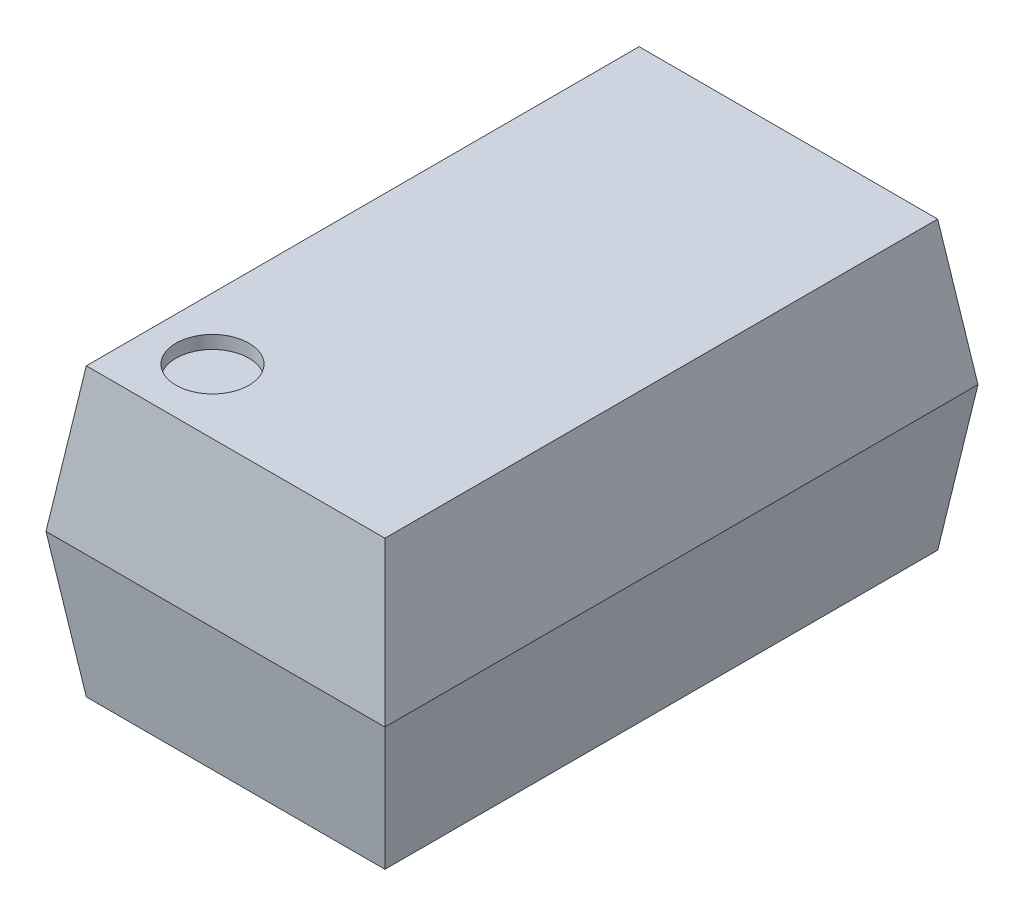
ISO-10303-21;
HEADER;
FILE_DESCRIPTION(('STEP AP214'),'2;1');
FILE_NAME('part.step','',(''),(''),'','','');
FILE_SCHEMA(('AUTOMOTIVE_DESIGN { 1 0 10303 214 1 1 1 1 }'));
ENDSEC;
DATA;
#1=APPLICATION_CONTEXT('core data for automotive mechanical design processes');
#2=APPLICATION_PROTOCOL_DEFINITION('international standard','automotive_design',2000,#1);
#3=PRODUCT_CONTEXT('',#1,'mechanical');
#4=PRODUCT('Part','Part','',(#3));
#5=PRODUCT_RELATED_PRODUCT_CATEGORY('part','',(#4));
#6=PRODUCT_DEFINITION_FORMATION('','',#4);
#7=PRODUCT_DEFINITION_CONTEXT('part definition',#1,'design');
#8=PRODUCT_DEFINITION('design','',#6,#7);
#9=PRODUCT_DEFINITION_SHAPE('','',#8);
#10=(LENGTH_UNIT() NAMED_UNIT(*) SI_UNIT(.MILLI.,.METRE.));
#11=(NAMED_UNIT(*) PLANE_ANGLE_UNIT() SI_UNIT($,.RADIAN.));
#12=(NAMED_UNIT(*) SI_UNIT($,.STERADIAN.) SOLID_ANGLE_UNIT());
#13=UNCERTAINTY_MEASURE_WITH_UNIT(LENGTH_MEASURE(1.E-05),#10,'distance_accuracy_value','');
#14=(GEOMETRIC_REPRESENTATION_CONTEXT(3) GLOBAL_UNCERTAINTY_ASSIGNED_CONTEXT((#13)) GLOBAL_UNIT_ASSIGNED_CONTEXT((#10,
#11,#12)) REPRESENTATION_CONTEXT('',''));
#15=CARTESIAN_POINT('',(0.,0.,0.));
#16=DIRECTION('',(0.,0.,1.));
#17=DIRECTION('',(1.,0.,0.));
#18=AXIS2_PLACEMENT_3D('',#15,#16,#17);
#19=CARTESIAN_POINT('',(-0.672081381027,2.2,1.625723674004));
#20=DIRECTION('',(0.,1.,0.));
#21=DIRECTION('',(0.,0.,1.));
#22=AXIS2_PLACEMENT_3D('',#19,#20,#21);
#23=PLANE('',#22);
#24=CARTESIAN_POINT('',(-0.672081381027,2.2,1.625723674004));
#25=DIRECTION('',(0.,1.,0.));
#26=DIRECTION('',(0.,0.,1.));
#27=AXIS2_PLACEMENT_3D('',#24,#25,#26);
#28=CIRCLE('',#27,0.279820492662);
#29=CARTESIAN_POINT('',(-0.672081381027,2.2,1.905544166666));
#30=VERTEX_POINT('',#29);
#31=EDGE_CURVE('E20',#30,#30,#28,.T.);
#32=ORIENTED_EDGE('',*,*,#31,.T.);
#33=EDGE_LOOP('',(#32));
#34=FACE_BOUND('',#33,.T.);
#35=ADVANCED_FACE('F17',(#34),#23,.T.);
#36=CARTESIAN_POINT('',(-0.672081381027,2.2,1.625723674004));
#37=DIRECTION('',(0.,1.,0.));
#38=DIRECTION('',(0.,0.,1.));
#39=AXIS2_PLACEMENT_3D('',#36,#37,#38);
#40=CYLINDRICAL_SURFACE('',#39,0.279820492662);
#41=CARTESIAN_POINT('',(-0.672081381027,2.3,1.625723674004));
#42=DIRECTION('',(0.,1.,0.));
#43=DIRECTION('',(0.,0.,1.));
#44=AXIS2_PLACEMENT_3D('',#41,#42,#43);
#45=CIRCLE('',#44,0.279820492662);
#46=CARTESIAN_POINT('',(-0.672081381027,2.3,1.905544166666));
#47=VERTEX_POINT('',#46);
#48=EDGE_CURVE('E90',#47,#47,#45,.F.);
#49=ORIENTED_EDGE('',*,*,#48,.F.);
#50=EDGE_LOOP('',(#49));
#51=FACE_BOUND('',#50,.T.);
#52=ORIENTED_EDGE('',*,*,#31,.F.);
#53=EDGE_LOOP('',(#52));
#54=FACE_BOUND('',#53,.T.);
#55=ADVANCED_FACE('F105',(#51,#54),#40,.F.);
#56=CARTESIAN_POINT('',(0.,2.3,0.));
#57=DIRECTION('',(0.,1.,0.));
#58=DIRECTION('',(0.,0.,1.));
#59=AXIS2_PLACEMENT_3D('',#56,#57,#58);
#60=PLANE('',#59);
#61=DIRECTION('',(0.,0.,1.));
#62=VECTOR('',#61,1.);
#63=CARTESIAN_POINT('',(1.1454050818275,2.30000000000007,2.275));
#64=LINE('',#63,#62);
#65=CARTESIAN_POINT('',(1.14540508182712,2.30000000000003,-2.12040508182712));
#66=VERTEX_POINT('',#65);
#67=CARTESIAN_POINT('',(1.14540508182712,2.30000000000003,2.12040508182712));
#68=VERTEX_POINT('',#67);
#69=EDGE_CURVE('E72',#66,#68,#64,.T.);
#70=ORIENTED_EDGE('',*,*,#69,.F.);
#71=DIRECTION('',(1.,0.,0.));
#72=VECTOR('',#71,1.);
#73=CARTESIAN_POINT('',(1.3,2.30000000000007,-2.1204050818275));
#74=LINE('',#73,#72);
#75=CARTESIAN_POINT('',(-1.14540508182712,2.30000000000003,-2.12040508182712));
#76=VERTEX_POINT('',#75);
#77=EDGE_CURVE('E67',#76,#66,#74,.T.);
#78=ORIENTED_EDGE('',*,*,#77,.F.);
#79=DIRECTION('',(0.,0.,1.));
#80=VECTOR('',#79,1.);
#81=CARTESIAN_POINT('',(-1.1454050818275,2.30000000000007,2.275));
#82=LINE('',#81,#80);
#83=CARTESIAN_POINT('',(-1.14540508182712,2.30000000000005,2.12040508182725));
#84=VERTEX_POINT('',#83);
#85=EDGE_CURVE('E86',#84,#76,#82,.F.);
#86=ORIENTED_EDGE('',*,*,#85,.F.);
#87=DIRECTION('',(1.,0.,0.));
#88=VECTOR('',#87,1.);
#89=CARTESIAN_POINT('',(1.3,2.30000000000007,2.1204050818275));
#90=LINE('',#89,#88);
#91=EDGE_CURVE('E81',#68,#84,#90,.F.);
#92=ORIENTED_EDGE('',*,*,#91,.F.);
#93=EDGE_LOOP('',(#70,#78,#86,#92));
#94=FACE_BOUND('',#93,.T.);
#95=ORIENTED_EDGE('',*,*,#48,.T.);
#96=EDGE_LOOP('',(#95));
#97=FACE_BOUND('',#96,.T.);
#98=ADVANCED_FACE('F84',(#94,#97),#60,.T.);
#99=CARTESIAN_POINT('',(1.3,1.2,2.275));
#100=DIRECTION('',(0.,0.139173100959942,0.990268068741588));
#101=DIRECTION('',(0.,-0.990268068741588,0.139173100959942));
#102=AXIS2_PLACEMENT_3D('',#99,#100,#101);
#103=PLANE('',#102);
#104=ORIENTED_EDGE('',*,*,#91,.T.);
#105=DIRECTION('',(0.1378445374915,0.980814848463963,-0.137844537491945));
#106=VECTOR('',#105,1.);
#107=CARTESIAN_POINT('',(-1.3,1.2,2.275));
#108=LINE('',#107,#106);
#109=CARTESIAN_POINT('',(-1.3,1.2,2.275));
#110=VERTEX_POINT('',#109);
#111=EDGE_CURVE('E224',#110,#84,#108,.T.);
#112=ORIENTED_EDGE('',*,*,#111,.F.);
#113=DIRECTION('',(1.,0.,0.));
#114=VECTOR('',#113,1.);
#115=CARTESIAN_POINT('',(1.3,1.2,2.275));
#116=LINE('',#115,#114);
#117=CARTESIAN_POINT('',(1.3,1.2,2.275));
#118=VERTEX_POINT('',#117);
#119=EDGE_CURVE('E94',#118,#110,#116,.F.);
#120=ORIENTED_EDGE('',*,*,#119,.F.);
#121=DIRECTION('',(0.1378445374915,-0.980814848463963,0.137844537491945));
#122=VECTOR('',#121,1.);
#123=CARTESIAN_POINT('',(1.1454050818275,2.30000000000007,2.120405081827));
#124=LINE('',#123,#122);
#125=EDGE_CURVE('E77',#68,#118,#124,.T.);
#126=ORIENTED_EDGE('',*,*,#125,.F.);
#127=EDGE_LOOP('',(#104,#112,#120,#126));
#128=FACE_BOUND('',#127,.T.);
#129=ADVANCED_FACE('F93',(#128),#103,.T.);
#130=CARTESIAN_POINT('',(1.3,1.2,2.275));
#131=DIRECTION('',(0.990268068741588,0.139173100959942,0.));
#132=DIRECTION('',(-0.139173100959942,0.990268068741588,0.));
#133=AXIS2_PLACEMENT_3D('',#130,#131,#132);
#134=PLANE('',#133);
#135=ORIENTED_EDGE('',*,*,#69,.T.);
#136=ORIENTED_EDGE('',*,*,#125,.T.);
#137=DIRECTION('',(0.,0.,1.));
#138=VECTOR('',#137,1.);
#139=CARTESIAN_POINT('',(1.3,1.2,2.275));
#140=LINE('',#139,#138);
#141=CARTESIAN_POINT('',(1.3,1.2,-2.275));
#142=VERTEX_POINT('',#141);
#143=EDGE_CURVE('E230',#142,#118,#140,.T.);
#144=ORIENTED_EDGE('',*,*,#143,.F.);
#145=DIRECTION('',(0.137844537491945,-0.980814848463963,-0.1378445374915));
#146=VECTOR('',#145,1.);
#147=CARTESIAN_POINT('',(1.145405081827,2.30000000000007,-2.1204050818275));
#148=LINE('',#147,#146);
#149=EDGE_CURVE('E79',#66,#142,#148,.T.);
#150=ORIENTED_EDGE('',*,*,#149,.F.);
#151=EDGE_LOOP('',(#135,#136,#144,#150));
#152=FACE_BOUND('',#151,.T.);
#153=ADVANCED_FACE('F74',(#152),#134,.T.);
#154=CARTESIAN_POINT('',(1.3,1.2,-2.275));
#155=DIRECTION('',(0.,0.139173100959942,-0.990268068741588));
#156=DIRECTION('',(0.,0.990268068741588,0.139173100959942));
#157=AXIS2_PLACEMENT_3D('',#154,#155,#156);
#158=PLANE('',#157);
#159=ORIENTED_EDGE('',*,*,#77,.T.);
#160=ORIENTED_EDGE('',*,*,#149,.T.);
#161=DIRECTION('',(1.,0.,0.));
#162=VECTOR('',#161,1.);
#163=CARTESIAN_POINT('',(1.3,1.2,-2.275));
#164=LINE('',#163,#162);
#165=CARTESIAN_POINT('',(-1.3,1.2,-2.275));
#166=VERTEX_POINT('',#165);
#167=EDGE_CURVE('E228',#166,#142,#164,.T.);
#168=ORIENTED_EDGE('',*,*,#167,.F.);
#169=DIRECTION('',(-0.1378445374915,-0.980814848463963,-0.137844537491946));
#170=VECTOR('',#169,1.);
#171=CARTESIAN_POINT('',(-1.1454050818275,2.30000000000007,-2.120405081827));
#172=LINE('',#171,#170);
#173=EDGE_CURVE('E223',#76,#166,#172,.T.);
#174=ORIENTED_EDGE('',*,*,#173,.F.);
#175=EDGE_LOOP('',(#159,#160,#168,#174));
#176=FACE_BOUND('',#175,.T.);
#177=ADVANCED_FACE('F140',(#176),#158,.T.);
#178=CARTESIAN_POINT('',(-1.3,1.2,2.275));
#179=DIRECTION('',(-0.990268068741588,0.139173100959942,0.));
#180=DIRECTION('',(-0.139173100959942,-0.990268068741588,0.));
#181=AXIS2_PLACEMENT_3D('',#178,#179,#180);
#182=PLANE('',#181);
#183=ORIENTED_EDGE('',*,*,#85,.T.);
#184=ORIENTED_EDGE('',*,*,#173,.T.);
#185=DIRECTION('',(0.,0.,1.));
#186=VECTOR('',#185,1.);
#187=CARTESIAN_POINT('',(-1.3,1.2,2.275));
#188=LINE('',#187,#186);
#189=EDGE_CURVE('E242',#110,#166,#188,.F.);
#190=ORIENTED_EDGE('',*,*,#189,.F.);
#191=ORIENTED_EDGE('',*,*,#111,.T.);
#192=EDGE_LOOP('',(#183,#184,#190,#191));
#193=FACE_BOUND('',#192,.T.);
#194=ADVANCED_FACE('F136',(#193),#182,.T.);
#195=CARTESIAN_POINT('',(1.3,1.2,2.275));
#196=DIRECTION('',(0.,-0.139173100959942,0.990268068741588));
#197=DIRECTION('',(0.,-0.990268068741588,-0.139173100959942));
#198=AXIS2_PLACEMENT_3D('',#195,#196,#197);
#199=PLANE('',#198);
#200=DIRECTION('',(1.,0.,0.));
#201=VECTOR('',#200,1.);
#202=CARTESIAN_POINT('',(0.,0.1,2.120405081827));
#203=LINE('',#202,#201);
#204=CARTESIAN_POINT('',(-1.14540508182712,0.0999999999999473,2.12040508182725));
#205=VERTEX_POINT('',#204);
#206=CARTESIAN_POINT('',(1.14540508182712,0.0999999999999473,2.12040508182725));
#207=VERTEX_POINT('',#206);
#208=EDGE_CURVE('E248',#205,#207,#203,.T.);
#209=ORIENTED_EDGE('',*,*,#208,.T.);
#210=DIRECTION('',(-0.1378445374915,-0.980814848463963,-0.137844537491945));
#211=VECTOR('',#210,1.);
#212=CARTESIAN_POINT('',(1.3,1.2,2.275));
#213=LINE('',#212,#211);
#214=EDGE_CURVE('E237',#118,#207,#213,.T.);
#215=ORIENTED_EDGE('',*,*,#214,.F.);
#216=ORIENTED_EDGE('',*,*,#119,.T.);
#217=DIRECTION('',(-0.1378445374915,0.980814848463963,0.137844537491945));
#218=VECTOR('',#217,1.);
#219=CARTESIAN_POINT('',(-1.1454050818275,0.0999999999999298,2.120405081827));
#220=LINE('',#219,#218);
#221=EDGE_CURVE('E252',#205,#110,#220,.T.);
#222=ORIENTED_EDGE('',*,*,#221,.F.);
#223=EDGE_LOOP('',(#209,#215,#216,#222));
#224=FACE_BOUND('',#223,.T.);
#225=ADVANCED_FACE('F132',(#224),#199,.T.);
#226=CARTESIAN_POINT('',(1.3,1.2,2.275));
#227=DIRECTION('',(0.990268068741588,-0.139173100959942,0.));
#228=DIRECTION('',(0.139173100959942,0.990268068741588,0.));
#229=AXIS2_PLACEMENT_3D('',#226,#227,#228);
#230=PLANE('',#229);
#231=DIRECTION('',(0.,0.,1.));
#232=VECTOR('',#231,1.);
#233=CARTESIAN_POINT('',(1.145405081827,0.1,0.));
#234=LINE('',#233,#232);
#235=CARTESIAN_POINT('',(1.14540508182725,0.0999999999999473,-2.12040508182712));
#236=VERTEX_POINT('',#235);
#237=EDGE_CURVE('E241',#207,#236,#234,.F.);
#238=ORIENTED_EDGE('',*,*,#237,.T.);
#239=DIRECTION('',(-0.137844537491945,-0.980814848463963,0.1378445374915));
#240=VECTOR('',#239,1.);
#241=CARTESIAN_POINT('',(1.3,1.2,-2.275));
#242=LINE('',#241,#240);
#243=EDGE_CURVE('E236',#142,#236,#242,.T.);
#244=ORIENTED_EDGE('',*,*,#243,.F.);
#245=ORIENTED_EDGE('',*,*,#143,.T.);
#246=ORIENTED_EDGE('',*,*,#214,.T.);
#247=EDGE_LOOP('',(#238,#244,#245,#246));
#248=FACE_BOUND('',#247,.T.);
#249=ADVANCED_FACE('F128',(#248),#230,.T.);
#250=CARTESIAN_POINT('',(1.3,1.2,-2.275));
#251=DIRECTION('',(0.,-0.139173100959942,-0.990268068741588));
#252=DIRECTION('',(0.,0.990268068741588,-0.139173100959942));
#253=AXIS2_PLACEMENT_3D('',#250,#251,#252);
#254=PLANE('',#253);
#255=DIRECTION('',(1.,0.,0.));
#256=VECTOR('',#255,1.);
#257=CARTESIAN_POINT('',(0.,0.1,-2.120405081827));
#258=LINE('',#257,#256);
#259=CARTESIAN_POINT('',(-1.14540508182713,0.0999999999999473,-2.12040508182725));
#260=VERTEX_POINT('',#259);
#261=EDGE_CURVE('E26',#236,#260,#258,.F.);
#262=ORIENTED_EDGE('',*,*,#261,.T.);
#263=DIRECTION('',(0.1378445374915,-0.980814848463963,0.137844537491946));
#264=VECTOR('',#263,1.);
#265=CARTESIAN_POINT('',(-1.3,1.2,-2.275));
#266=LINE('',#265,#264);
#267=EDGE_CURVE('E34',#166,#260,#266,.T.);
#268=ORIENTED_EDGE('',*,*,#267,.F.);
#269=ORIENTED_EDGE('',*,*,#167,.T.);
#270=ORIENTED_EDGE('',*,*,#243,.T.);
#271=EDGE_LOOP('',(#262,#268,#269,#270));
#272=FACE_BOUND('',#271,.T.);
#273=ADVANCED_FACE('F122',(#272),#254,.T.);
#274=CARTESIAN_POINT('',(-1.3,1.2,2.275));
#275=DIRECTION('',(-0.990268068741588,-0.139173100959942,0.));
#276=DIRECTION('',(0.139173100959942,-0.990268068741588,0.));
#277=AXIS2_PLACEMENT_3D('',#274,#275,#276);
#278=PLANE('',#277);
#279=DIRECTION('',(0.,0.,1.));
#280=VECTOR('',#279,1.);
#281=CARTESIAN_POINT('',(-1.145405081827,0.1,0.));
#282=LINE('',#281,#280);
#283=EDGE_CURVE('E11',#260,#205,#282,.T.);
#284=ORIENTED_EDGE('',*,*,#283,.T.);
#285=ORIENTED_EDGE('',*,*,#221,.T.);
#286=ORIENTED_EDGE('',*,*,#189,.T.);
#287=ORIENTED_EDGE('',*,*,#267,.T.);
#288=EDGE_LOOP('',(#284,#285,#286,#287));
#289=FACE_BOUND('',#288,.T.);
#290=ADVANCED_FACE('F116',(#289),#278,.T.);
#291=CARTESIAN_POINT('',(0.,0.1,0.));
#292=DIRECTION('',(0.,1.,0.));
#293=DIRECTION('',(0.,0.,1.));
#294=AXIS2_PLACEMENT_3D('',#291,#292,#293);
#295=PLANE('',#294);
#296=ORIENTED_EDGE('',*,*,#261,.F.);
#297=ORIENTED_EDGE('',*,*,#237,.F.);
#298=ORIENTED_EDGE('',*,*,#208,.F.);
#299=ORIENTED_EDGE('',*,*,#283,.F.);
#300=EDGE_LOOP('',(#296,#297,#298,#299));
#301=FACE_BOUND('',#300,.T.);
#302=ADVANCED_FACE('F114',(#301),#295,.F.);
#303=CLOSED_SHELL('',(#35,#55,#98,#129,#153,#177,#194,#225,#249,#273,#290,#302));
#304=MANIFOLD_SOLID_BREP('B1',#303);
#305=ADVANCED_BREP_SHAPE_REPRESENTATION('',(#18,#304),#14);
#306=SHAPE_DEFINITION_REPRESENTATION(#9,#305);
ENDSEC;
END-ISO-10303-21;
